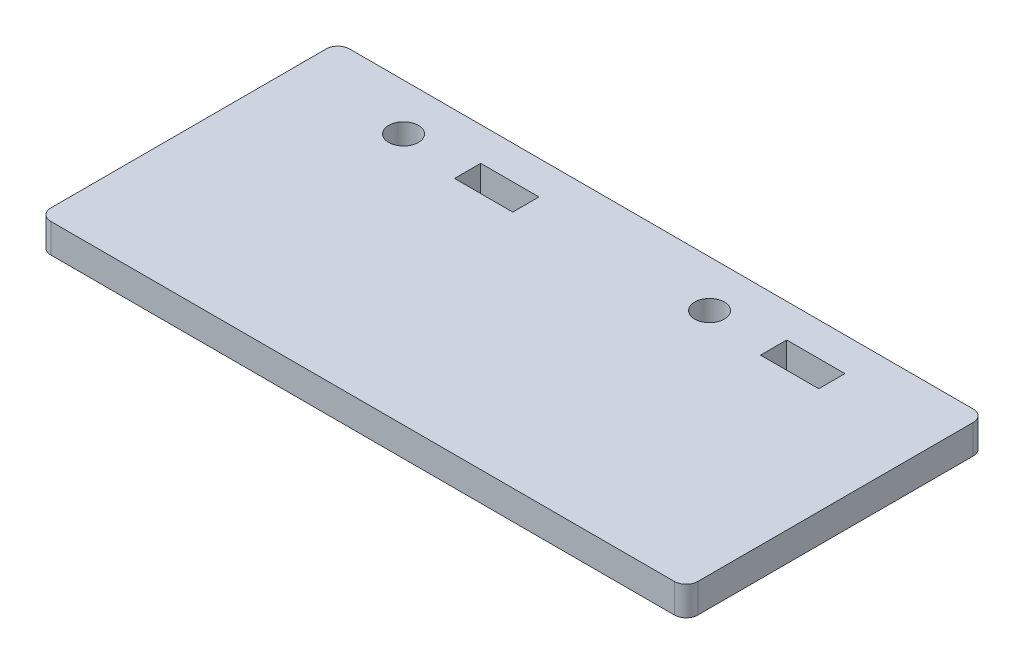
ISO-10303-21;
HEADER;
FILE_DESCRIPTION(('STEP AP214'),'2;1');
FILE_NAME('part.step','',(''),(''),'','','');
FILE_SCHEMA(('AUTOMOTIVE_DESIGN { 1 0 10303 214 1 1 1 1 }'));
ENDSEC;
DATA;
#1=APPLICATION_CONTEXT('core data for automotive mechanical design processes');
#2=APPLICATION_PROTOCOL_DEFINITION('international standard','automotive_design',2000,#1);
#3=PRODUCT_CONTEXT('',#1,'mechanical');
#4=PRODUCT('Part','Part','',(#3));
#5=PRODUCT_RELATED_PRODUCT_CATEGORY('part','',(#4));
#6=PRODUCT_DEFINITION_FORMATION('','',#4);
#7=PRODUCT_DEFINITION_CONTEXT('part definition',#1,'design');
#8=PRODUCT_DEFINITION('design','',#6,#7);
#9=PRODUCT_DEFINITION_SHAPE('','',#8);
#10=(LENGTH_UNIT() NAMED_UNIT(*) SI_UNIT(.MILLI.,.METRE.));
#11=(NAMED_UNIT(*) PLANE_ANGLE_UNIT() SI_UNIT($,.RADIAN.));
#12=(NAMED_UNIT(*) SI_UNIT($,.STERADIAN.) SOLID_ANGLE_UNIT());
#13=UNCERTAINTY_MEASURE_WITH_UNIT(LENGTH_MEASURE(1.E-05),#10,'distance_accuracy_value','');
#14=(GEOMETRIC_REPRESENTATION_CONTEXT(3) GLOBAL_UNCERTAINTY_ASSIGNED_CONTEXT((#13)) GLOBAL_UNIT_ASSIGNED_CONTEXT((#10,
#11,#12)) REPRESENTATION_CONTEXT('',''));
#15=CARTESIAN_POINT('',(0.,0.,0.));
#16=DIRECTION('',(0.,0.,1.));
#17=DIRECTION('',(1.,0.,0.));
#18=AXIS2_PLACEMENT_3D('',#15,#16,#17);
#19=CARTESIAN_POINT('',(0.,0.,0.));
#20=DIRECTION('',(0.,1.,0.));
#21=DIRECTION('',(0.,0.,1.));
#22=AXIS2_PLACEMENT_3D('',#19,#20,#21);
#23=PLANE('',#22);
#24=CARTESIAN_POINT('',(-30.025,0.,-17.65));
#25=DIRECTION('',(0.,-1.,0.));
#26=DIRECTION('',(0.,0.,-1.));
#27=AXIS2_PLACEMENT_3D('',#24,#25,#26);
#28=CIRCLE('',#27,1.8);
#29=CARTESIAN_POINT('',(-30.025,0.,-19.45));
#30=VERTEX_POINT('',#29);
#31=EDGE_CURVE('E793',#30,#30,#28,.T.);
#32=ORIENTED_EDGE('',*,*,#31,.F.);
#33=EDGE_LOOP('',(#32));
#34=FACE_BOUND('',#33,.T.);
#35=CARTESIAN_POINT('',(-10.525,0.,-17.65));
#36=DIRECTION('',(0.,-1.,0.));
#37=DIRECTION('',(0.,0.,-1.));
#38=AXIS2_PLACEMENT_3D('',#35,#36,#37);
#39=CIRCLE('',#38,1.8);
#40=CARTESIAN_POINT('',(-10.525,0.,-19.45));
#41=VERTEX_POINT('',#40);
#42=EDGE_CURVE('E801',#41,#41,#39,.T.);
#43=ORIENTED_EDGE('',*,*,#42,.F.);
#44=EDGE_LOOP('',(#43));
#45=FACE_BOUND('',#44,.T.);
#46=CARTESIAN_POINT('',(22.525,0.,-17.65));
#47=DIRECTION('',(0.,-1.,0.));
#48=DIRECTION('',(0.,0.,-1.));
#49=AXIS2_PLACEMENT_3D('',#46,#47,#48);
#50=CIRCLE('',#49,1.8);
#51=CARTESIAN_POINT('',(22.525,0.,-19.45));
#52=VERTEX_POINT('',#51);
#53=EDGE_CURVE('E807',#52,#52,#50,.T.);
#54=ORIENTED_EDGE('',*,*,#53,.F.);
#55=EDGE_LOOP('',(#54));
#56=FACE_BOUND('',#55,.T.);
#57=CARTESIAN_POINT('',(42.025,0.,-17.65));
#58=DIRECTION('',(0.,-1.,0.));
#59=DIRECTION('',(0.,0.,-1.));
#60=AXIS2_PLACEMENT_3D('',#57,#58,#59);
#61=CIRCLE('',#60,1.8);
#62=CARTESIAN_POINT('',(42.025,0.,-19.45));
#63=VERTEX_POINT('',#62);
#64=EDGE_CURVE('E813',#63,#63,#61,.T.);
#65=ORIENTED_EDGE('',*,*,#64,.F.);
#66=EDGE_LOOP('',(#65));
#67=FACE_BOUND('',#66,.T.);
#68=DIRECTION('',(-1.,0.,0.));
#69=VECTOR('',#68,1.);
#70=CARTESIAN_POINT('',(0.,0.,-19.9));
#71=LINE('',#70,#69);
#72=CARTESIAN_POINT('',(37.275,0.,-19.9));
#73=VERTEX_POINT('',#72);
#74=CARTESIAN_POINT('',(27.275,0.,-19.9));
#75=VERTEX_POINT('',#74);
#76=EDGE_CURVE('E278',#73,#75,#71,.T.);
#77=ORIENTED_EDGE('',*,*,#76,.T.);
#78=DIRECTION('',(0.,0.,1.));
#79=VECTOR('',#78,1.);
#80=CARTESIAN_POINT('',(27.275,0.,0.));
#81=LINE('',#80,#79);
#82=CARTESIAN_POINT('',(27.275,0.,-15.4));
#83=VERTEX_POINT('',#82);
#84=EDGE_CURVE('E281',#75,#83,#81,.T.);
#85=ORIENTED_EDGE('',*,*,#84,.T.);
#86=DIRECTION('',(1.,0.,0.));
#87=VECTOR('',#86,1.);
#88=CARTESIAN_POINT('',(0.,0.,-15.4));
#89=LINE('',#88,#87);
#90=CARTESIAN_POINT('',(37.275,0.,-15.4));
#91=VERTEX_POINT('',#90);
#92=EDGE_CURVE('E272',#83,#91,#89,.T.);
#93=ORIENTED_EDGE('',*,*,#92,.T.);
#94=DIRECTION('',(0.,0.,-1.));
#95=VECTOR('',#94,1.);
#96=CARTESIAN_POINT('',(37.275,0.,0.));
#97=LINE('',#96,#95);
#98=EDGE_CURVE('E275',#91,#73,#97,.T.);
#99=ORIENTED_EDGE('',*,*,#98,.T.);
#100=EDGE_LOOP('',(#77,#85,#93,#99));
#101=FACE_BOUND('',#100,.T.);
#102=DIRECTION('',(-1.,0.,0.));
#103=VECTOR('',#102,1.);
#104=CARTESIAN_POINT('',(0.,0.,-19.9));
#105=LINE('',#104,#103);
#106=CARTESIAN_POINT('',(-15.275,0.,-19.9));
#107=VERTEX_POINT('',#106);
#108=CARTESIAN_POINT('',(-25.275,0.,-19.9));
#109=VERTEX_POINT('',#108);
#110=EDGE_CURVE('E266',#107,#109,#105,.T.);
#111=ORIENTED_EDGE('',*,*,#110,.T.);
#112=DIRECTION('',(0.,0.,1.));
#113=VECTOR('',#112,1.);
#114=CARTESIAN_POINT('',(-25.275,0.,0.));
#115=LINE('',#114,#113);
#116=CARTESIAN_POINT('',(-25.275,0.,-15.4));
#117=VERTEX_POINT('',#116);
#118=EDGE_CURVE('E269',#109,#117,#115,.T.);
#119=ORIENTED_EDGE('',*,*,#118,.T.);
#120=DIRECTION('',(1.,0.,0.));
#121=VECTOR('',#120,1.);
#122=CARTESIAN_POINT('',(0.,0.,-15.4));
#123=LINE('',#122,#121);
#124=CARTESIAN_POINT('',(-15.275,0.,-15.4));
#125=VERTEX_POINT('',#124);
#126=EDGE_CURVE('E263',#117,#125,#123,.T.);
#127=ORIENTED_EDGE('',*,*,#126,.T.);
#128=DIRECTION('',(0.,0.,-1.));
#129=VECTOR('',#128,1.);
#130=CARTESIAN_POINT('',(-15.275,0.,0.));
#131=LINE('',#130,#129);
#132=EDGE_CURVE('E205',#125,#107,#131,.T.);
#133=ORIENTED_EDGE('',*,*,#132,.T.);
#134=EDGE_LOOP('',(#111,#119,#127,#133));
#135=FACE_BOUND('',#134,.T.);
#136=CARTESIAN_POINT('',(-36.275,0.,-17.65));
#137=DIRECTION('',(0.,1.,0.));
#138=DIRECTION('',(0.,0.,1.));
#139=AXIS2_PLACEMENT_3D('',#136,#137,#138);
#140=CIRCLE('',#139,2.55);
#141=CARTESIAN_POINT('',(-36.275,0.,-15.1));
#142=VERTEX_POINT('',#141);
#143=EDGE_CURVE('E260',#142,#142,#140,.T.);
#144=ORIENTED_EDGE('',*,*,#143,.T.);
#145=EDGE_LOOP('',(#144));
#146=FACE_BOUND('',#145,.T.);
#147=CARTESIAN_POINT('',(16.275,0.,-17.65));
#148=DIRECTION('',(0.,1.,0.));
#149=DIRECTION('',(0.,0.,1.));
#150=AXIS2_PLACEMENT_3D('',#147,#148,#149);
#151=CIRCLE('',#150,2.55);
#152=CARTESIAN_POINT('',(16.275,0.,-15.1));
#153=VERTEX_POINT('',#152);
#154=EDGE_CURVE('E257',#153,#153,#151,.T.);
#155=ORIENTED_EDGE('',*,*,#154,.T.);
#156=EDGE_LOOP('',(#155));
#157=FACE_BOUND('',#156,.T.);
#158=DIRECTION('',(0.,0.,1.));
#159=VECTOR('',#158,1.);
#160=CARTESIAN_POINT('',(-45.55,0.,-18.65));
#161=LINE('',#160,#159);
#162=CARTESIAN_POINT('',(-45.55,0.,-22.65));
#163=VERTEX_POINT('',#162);
#164=CARTESIAN_POINT('',(-45.55,0.,-18.65));
#165=VERTEX_POINT('',#164);
#166=EDGE_CURVE('E317',#163,#165,#161,.T.);
#167=ORIENTED_EDGE('',*,*,#166,.F.);
#168=DIRECTION('',(1.,0.,0.));
#169=VECTOR('',#168,1.);
#170=CARTESIAN_POINT('',(-50.55,0.,-22.65));
#171=LINE('',#170,#169);
#172=CARTESIAN_POINT('',(-50.55,0.,-22.65));
#173=VERTEX_POINT('',#172);
#174=EDGE_CURVE('E322',#173,#163,#171,.T.);
#175=ORIENTED_EDGE('',*,*,#174,.F.);
#176=DIRECTION('',(0.,0.,-1.));
#177=VECTOR('',#176,1.);
#178=CARTESIAN_POINT('',(-50.55,0.,-18.65));
#179=LINE('',#178,#177);
#180=CARTESIAN_POINT('',(-50.55,0.,-18.65));
#181=VERTEX_POINT('',#180);
#182=EDGE_CURVE('E334',#181,#173,#179,.T.);
#183=ORIENTED_EDGE('',*,*,#182,.F.);
#184=DIRECTION('',(-1.,0.,0.));
#185=VECTOR('',#184,1.);
#186=CARTESIAN_POINT('',(-50.55,0.,-18.65));
#187=LINE('',#186,#185);
#188=EDGE_CURVE('E331',#165,#181,#187,.T.);
#189=ORIENTED_EDGE('',*,*,#188,.F.);
#190=EDGE_LOOP('',(#167,#175,#183,#189));
#191=FACE_BOUND('',#190,.T.);
#192=DIRECTION('',(0.,0.,1.));
#193=VECTOR('',#192,1.);
#194=CARTESIAN_POINT('',(-55.55,0.,25.65));
#195=LINE('',#194,#193);
#196=CARTESIAN_POINT('',(-55.55,0.,-23.65));
#197=VERTEX_POINT('',#196);
#198=CARTESIAN_POINT('',(-55.55,0.,23.65));
#199=VERTEX_POINT('',#198);
#200=EDGE_CURVE('E350',#197,#199,#195,.T.);
#201=ORIENTED_EDGE('',*,*,#200,.F.);
#202=CARTESIAN_POINT('',(-53.55,0.,-23.65));
#203=DIRECTION('',(0.,1.,0.));
#204=DIRECTION('',(0.,0.,1.));
#205=AXIS2_PLACEMENT_3D('',#202,#203,#204);
#206=CIRCLE('',#205,2.);
#207=CARTESIAN_POINT('',(-53.55,0.,-25.65));
#208=VERTEX_POINT('',#207);
#209=EDGE_CURVE('E382',#197,#208,#206,.F.);
#210=ORIENTED_EDGE('',*,*,#209,.T.);
#211=DIRECTION('',(-1.,0.,0.));
#212=VECTOR('',#211,1.);
#213=CARTESIAN_POINT('',(55.55,0.,-25.65));
#214=LINE('',#213,#212);
#215=CARTESIAN_POINT('',(53.55,0.,-25.65));
#216=VERTEX_POINT('',#215);
#217=EDGE_CURVE('E355',#216,#208,#214,.T.);
#218=ORIENTED_EDGE('',*,*,#217,.F.);
#219=CARTESIAN_POINT('',(53.55,0.,-23.65));
#220=DIRECTION('',(0.,1.,0.));
#221=DIRECTION('',(0.,0.,1.));
#222=AXIS2_PLACEMENT_3D('',#219,#220,#221);
#223=CIRCLE('',#222,2.);
#224=CARTESIAN_POINT('',(55.55,0.,-23.65));
#225=VERTEX_POINT('',#224);
#226=EDGE_CURVE('E376',#216,#225,#223,.F.);
#227=ORIENTED_EDGE('',*,*,#226,.T.);
#228=DIRECTION('',(0.,0.,-1.));
#229=VECTOR('',#228,1.);
#230=CARTESIAN_POINT('',(55.55,0.,25.65));
#231=LINE('',#230,#229);
#232=CARTESIAN_POINT('',(55.55,0.,23.65));
#233=VERTEX_POINT('',#232);
#234=EDGE_CURVE('E368',#233,#225,#231,.T.);
#235=ORIENTED_EDGE('',*,*,#234,.F.);
#236=CARTESIAN_POINT('',(53.55,0.,23.65));
#237=DIRECTION('',(0.,1.,0.));
#238=DIRECTION('',(0.,0.,1.));
#239=AXIS2_PLACEMENT_3D('',#236,#237,#238);
#240=CIRCLE('',#239,2.);
#241=CARTESIAN_POINT('',(53.55,0.,25.65));
#242=VERTEX_POINT('',#241);
#243=EDGE_CURVE('E378',#233,#242,#240,.F.);
#244=ORIENTED_EDGE('',*,*,#243,.T.);
#245=DIRECTION('',(1.,0.,0.));
#246=VECTOR('',#245,1.);
#247=CARTESIAN_POINT('',(55.55,0.,25.65));
#248=LINE('',#247,#246);
#249=CARTESIAN_POINT('',(-53.55,0.,25.65));
#250=VERTEX_POINT('',#249);
#251=EDGE_CURVE('E365',#250,#242,#248,.T.);
#252=ORIENTED_EDGE('',*,*,#251,.F.);
#253=CARTESIAN_POINT('',(-53.55,0.,23.65));
#254=DIRECTION('',(0.,1.,0.));
#255=DIRECTION('',(0.,0.,1.));
#256=AXIS2_PLACEMENT_3D('',#253,#254,#255);
#257=CIRCLE('',#256,2.);
#258=EDGE_CURVE('E380',#250,#199,#257,.F.);
#259=ORIENTED_EDGE('',*,*,#258,.T.);
#260=EDGE_LOOP('',(#201,#210,#218,#227,#235,#244,#252,#259));
#261=FACE_BOUND('',#260,.T.);
#262=DIRECTION('',(-1.,0.,0.));
#263=VECTOR('',#262,1.);
#264=CARTESIAN_POINT('',(50.55,0.,-18.65));
#265=LINE('',#264,#263);
#266=CARTESIAN_POINT('',(50.55,0.,-18.65));
#267=VERTEX_POINT('',#266);
#268=CARTESIAN_POINT('',(45.55,0.,-18.65));
#269=VERTEX_POINT('',#268);
#270=EDGE_CURVE('E284',#267,#269,#265,.T.);
#271=ORIENTED_EDGE('',*,*,#270,.F.);
#272=DIRECTION('',(0.,0.,1.));
#273=VECTOR('',#272,1.);
#274=CARTESIAN_POINT('',(50.55,0.,-18.65));
#275=LINE('',#274,#273);
#276=CARTESIAN_POINT('',(50.55,0.,-22.65));
#277=VERTEX_POINT('',#276);
#278=EDGE_CURVE('E289',#277,#267,#275,.T.);
#279=ORIENTED_EDGE('',*,*,#278,.F.);
#280=DIRECTION('',(1.,0.,0.));
#281=VECTOR('',#280,1.);
#282=CARTESIAN_POINT('',(50.55,0.,-22.65));
#283=LINE('',#282,#281);
#284=CARTESIAN_POINT('',(45.55,0.,-22.65));
#285=VERTEX_POINT('',#284);
#286=EDGE_CURVE('E301',#285,#277,#283,.T.);
#287=ORIENTED_EDGE('',*,*,#286,.F.);
#288=DIRECTION('',(0.,0.,-1.));
#289=VECTOR('',#288,1.);
#290=CARTESIAN_POINT('',(45.55,0.,-18.65));
#291=LINE('',#290,#289);
#292=EDGE_CURVE('E298',#269,#285,#291,.T.);
#293=ORIENTED_EDGE('',*,*,#292,.F.);
#294=EDGE_LOOP('',(#271,#279,#287,#293));
#295=FACE_BOUND('',#294,.T.);
#296=ADVANCED_FACE('F35',(#34,#45,#56,#67,#101,#135,#146,#157,#191,#261,#295),#23,.F.);
#297=CARTESIAN_POINT('',(-55.55,5.,25.65));
#298=DIRECTION('',(1.,0.,0.));
#299=DIRECTION('',(0.,0.,-1.));
#300=AXIS2_PLACEMENT_3D('',#297,#298,#299);
#301=PLANE('',#300);
#302=DIRECTION('',(0.,0.,1.));
#303=VECTOR('',#302,1.);
#304=CARTESIAN_POINT('',(-55.55,5.,25.65));
#305=LINE('',#304,#303);
#306=CARTESIAN_POINT('',(-55.55,5.,-23.65));
#307=VERTEX_POINT('',#306);
#308=CARTESIAN_POINT('',(-55.55,5.,23.65));
#309=VERTEX_POINT('',#308);
#310=EDGE_CURVE('E351',#307,#309,#305,.T.);
#311=ORIENTED_EDGE('',*,*,#310,.F.);
#312=DIRECTION('',(0.,-1.,0.));
#313=VECTOR('',#312,1.);
#314=CARTESIAN_POINT('',(-55.55,5.,-23.65));
#315=LINE('',#314,#313);
#316=EDGE_CURVE('E373',#307,#197,#315,.T.);
#317=ORIENTED_EDGE('',*,*,#316,.T.);
#318=ORIENTED_EDGE('',*,*,#200,.T.);
#319=DIRECTION('',(0.,-1.,0.));
#320=VECTOR('',#319,1.);
#321=CARTESIAN_POINT('',(-55.55,5.,23.65));
#322=LINE('',#321,#320);
#323=EDGE_CURVE('E362',#199,#309,#322,.F.);
#324=ORIENTED_EDGE('',*,*,#323,.T.);
#325=EDGE_LOOP('',(#311,#317,#318,#324));
#326=FACE_BOUND('',#325,.T.);
#327=ADVANCED_FACE('F430',(#326),#301,.F.);
#328=CARTESIAN_POINT('',(55.55,5.,25.65));
#329=DIRECTION('',(0.,0.,-1.));
#330=DIRECTION('',(-1.,0.,0.));
#331=AXIS2_PLACEMENT_3D('',#328,#329,#330);
#332=PLANE('',#331);
#333=DIRECTION('',(1.,0.,0.));
#334=VECTOR('',#333,1.);
#335=CARTESIAN_POINT('',(55.55,5.,25.65));
#336=LINE('',#335,#334);
#337=CARTESIAN_POINT('',(-53.55,5.,25.65));
#338=VERTEX_POINT('',#337);
#339=CARTESIAN_POINT('',(53.55,5.,25.65));
#340=VERTEX_POINT('',#339);
#341=EDGE_CURVE('E354',#338,#340,#336,.T.);
#342=ORIENTED_EDGE('',*,*,#341,.F.);
#343=DIRECTION('',(0.,-1.,0.));
#344=VECTOR('',#343,1.);
#345=CARTESIAN_POINT('',(-53.55,5.,25.65));
#346=LINE('',#345,#344);
#347=EDGE_CURVE('E398',#338,#250,#346,.T.);
#348=ORIENTED_EDGE('',*,*,#347,.T.);
#349=ORIENTED_EDGE('',*,*,#251,.T.);
#350=DIRECTION('',(0.,-1.,0.));
#351=VECTOR('',#350,1.);
#352=CARTESIAN_POINT('',(53.55,5.,25.65));
#353=LINE('',#352,#351);
#354=EDGE_CURVE('E396',#242,#340,#353,.F.);
#355=ORIENTED_EDGE('',*,*,#354,.T.);
#356=EDGE_LOOP('',(#342,#348,#349,#355));
#357=FACE_BOUND('',#356,.T.);
#358=ADVANCED_FACE('F404',(#357),#332,.F.);
#359=CARTESIAN_POINT('',(55.55,5.,25.65));
#360=DIRECTION('',(-1.,0.,0.));
#361=DIRECTION('',(0.,0.,1.));
#362=AXIS2_PLACEMENT_3D('',#359,#360,#361);
#363=PLANE('',#362);
#364=DIRECTION('',(0.,0.,-1.));
#365=VECTOR('',#364,1.);
#366=CARTESIAN_POINT('',(55.55,5.,25.65));
#367=LINE('',#366,#365);
#368=CARTESIAN_POINT('',(55.55,5.,23.65));
#369=VERTEX_POINT('',#368);
#370=CARTESIAN_POINT('',(55.55,5.,-23.65));
#371=VERTEX_POINT('',#370);
#372=EDGE_CURVE('E357',#369,#371,#367,.T.);
#373=ORIENTED_EDGE('',*,*,#372,.F.);
#374=DIRECTION('',(0.,-1.,0.));
#375=VECTOR('',#374,1.);
#376=CARTESIAN_POINT('',(55.55,5.,23.65));
#377=LINE('',#376,#375);
#378=EDGE_CURVE('E11',#369,#233,#377,.T.);
#379=ORIENTED_EDGE('',*,*,#378,.T.);
#380=ORIENTED_EDGE('',*,*,#234,.T.);
#381=DIRECTION('',(0.,-1.,0.));
#382=VECTOR('',#381,1.);
#383=CARTESIAN_POINT('',(55.55,5.,-23.65));
#384=LINE('',#383,#382);
#385=EDGE_CURVE('E43',#225,#371,#384,.F.);
#386=ORIENTED_EDGE('',*,*,#385,.T.);
#387=EDGE_LOOP('',(#373,#379,#380,#386));
#388=FACE_BOUND('',#387,.T.);
#389=ADVANCED_FACE('F415',(#388),#363,.F.);
#390=CARTESIAN_POINT('',(55.55,5.,-25.65));
#391=DIRECTION('',(0.,0.,1.));
#392=DIRECTION('',(1.,0.,0.));
#393=AXIS2_PLACEMENT_3D('',#390,#391,#392);
#394=PLANE('',#393);
#395=ORIENTED_EDGE('',*,*,#217,.T.);
#396=DIRECTION('',(0.,-1.,0.));
#397=VECTOR('',#396,1.);
#398=CARTESIAN_POINT('',(-53.55,5.,-25.65));
#399=LINE('',#398,#397);
#400=CARTESIAN_POINT('',(-53.55,5.,-25.65));
#401=VERTEX_POINT('',#400);
#402=EDGE_CURVE('E387',#208,#401,#399,.F.);
#403=ORIENTED_EDGE('',*,*,#402,.T.);
#404=DIRECTION('',(-1.,0.,0.));
#405=VECTOR('',#404,1.);
#406=CARTESIAN_POINT('',(55.55,5.,-25.65));
#407=LINE('',#406,#405);
#408=CARTESIAN_POINT('',(53.55,5.,-25.65));
#409=VERTEX_POINT('',#408);
#410=EDGE_CURVE('E359',#409,#401,#407,.T.);
#411=ORIENTED_EDGE('',*,*,#410,.F.);
#412=DIRECTION('',(0.,-1.,0.));
#413=VECTOR('',#412,1.);
#414=CARTESIAN_POINT('',(53.55,5.,-25.65));
#415=LINE('',#414,#413);
#416=EDGE_CURVE('E384',#409,#216,#415,.T.);
#417=ORIENTED_EDGE('',*,*,#416,.T.);
#418=EDGE_LOOP('',(#395,#403,#411,#417));
#419=FACE_BOUND('',#418,.T.);
#420=ADVANCED_FACE('F422',(#419),#394,.F.);
#421=CARTESIAN_POINT('',(0.,5.,0.));
#422=DIRECTION('',(0.,1.,0.));
#423=DIRECTION('',(0.,0.,1.));
#424=AXIS2_PLACEMENT_3D('',#421,#422,#423);
#425=PLANE('',#424);
#426=DIRECTION('',(0.,0.,1.));
#427=VECTOR('',#426,1.);
#428=CARTESIAN_POINT('',(27.275,5.,-15.4));
#429=LINE('',#428,#427);
#430=CARTESIAN_POINT('',(27.275,5.,-19.9));
#431=VERTEX_POINT('',#430);
#432=CARTESIAN_POINT('',(27.275,5.,-15.4));
#433=VERTEX_POINT('',#432);
#434=EDGE_CURVE('E233',#431,#433,#429,.T.);
#435=ORIENTED_EDGE('',*,*,#434,.F.);
#436=DIRECTION('',(-1.,0.,0.));
#437=VECTOR('',#436,1.);
#438=CARTESIAN_POINT('',(37.275,5.,-19.9));
#439=LINE('',#438,#437);
#440=CARTESIAN_POINT('',(37.275,5.,-19.9));
#441=VERTEX_POINT('',#440);
#442=EDGE_CURVE('E242',#441,#431,#439,.T.);
#443=ORIENTED_EDGE('',*,*,#442,.F.);
#444=DIRECTION('',(0.,0.,-1.));
#445=VECTOR('',#444,1.);
#446=CARTESIAN_POINT('',(37.275,5.,-15.4));
#447=LINE('',#446,#445);
#448=CARTESIAN_POINT('',(37.275,5.,-15.4));
#449=VERTEX_POINT('',#448);
#450=EDGE_CURVE('E239',#449,#441,#447,.T.);
#451=ORIENTED_EDGE('',*,*,#450,.F.);
#452=DIRECTION('',(1.,0.,0.));
#453=VECTOR('',#452,1.);
#454=CARTESIAN_POINT('',(37.275,5.,-15.4));
#455=LINE('',#454,#453);
#456=EDGE_CURVE('E235',#433,#449,#455,.T.);
#457=ORIENTED_EDGE('',*,*,#456,.F.);
#458=EDGE_LOOP('',(#435,#443,#451,#457));
#459=FACE_BOUND('',#458,.T.);
#460=DIRECTION('',(0.,0.,1.));
#461=VECTOR('',#460,1.);
#462=CARTESIAN_POINT('',(-25.275,5.,-15.4));
#463=LINE('',#462,#461);
#464=CARTESIAN_POINT('',(-25.275,5.,-19.9));
#465=VERTEX_POINT('',#464);
#466=CARTESIAN_POINT('',(-25.275,5.,-15.4));
#467=VERTEX_POINT('',#466);
#468=EDGE_CURVE('E218',#465,#467,#463,.T.);
#469=ORIENTED_EDGE('',*,*,#468,.F.);
#470=DIRECTION('',(-1.,0.,0.));
#471=VECTOR('',#470,1.);
#472=CARTESIAN_POINT('',(-15.275,5.,-19.9));
#473=LINE('',#472,#471);
#474=CARTESIAN_POINT('',(-15.275,5.,-19.9));
#475=VERTEX_POINT('',#474);
#476=EDGE_CURVE('E223',#475,#465,#473,.T.);
#477=ORIENTED_EDGE('',*,*,#476,.F.);
#478=DIRECTION('',(0.,0.,-1.));
#479=VECTOR('',#478,1.);
#480=CARTESIAN_POINT('',(-15.275,5.,-15.4));
#481=LINE('',#480,#479);
#482=CARTESIAN_POINT('',(-15.275,5.,-15.4));
#483=VERTEX_POINT('',#482);
#484=EDGE_CURVE('E202',#483,#475,#481,.T.);
#485=ORIENTED_EDGE('',*,*,#484,.F.);
#486=DIRECTION('',(1.,0.,0.));
#487=VECTOR('',#486,1.);
#488=CARTESIAN_POINT('',(-15.275,5.,-15.4));
#489=LINE('',#488,#487);
#490=EDGE_CURVE('E213',#467,#483,#489,.T.);
#491=ORIENTED_EDGE('',*,*,#490,.F.);
#492=EDGE_LOOP('',(#469,#477,#485,#491));
#493=FACE_BOUND('',#492,.T.);
#494=CARTESIAN_POINT('',(-36.275,5.,-17.65));
#495=DIRECTION('',(0.,1.,0.));
#496=DIRECTION('',(0.,0.,1.));
#497=AXIS2_PLACEMENT_3D('',#494,#495,#496);
#498=CIRCLE('',#497,2.55);
#499=CARTESIAN_POINT('',(-36.275,5.,-15.1));
#500=VERTEX_POINT('',#499);
#501=EDGE_CURVE('E230',#500,#500,#498,.T.);
#502=ORIENTED_EDGE('',*,*,#501,.F.);
#503=EDGE_LOOP('',(#502));
#504=FACE_BOUND('',#503,.T.);
#505=CARTESIAN_POINT('',(16.275,5.,-17.65));
#506=DIRECTION('',(0.,1.,0.));
#507=DIRECTION('',(0.,0.,1.));
#508=AXIS2_PLACEMENT_3D('',#505,#506,#507);
#509=CIRCLE('',#508,2.55);
#510=CARTESIAN_POINT('',(16.275,5.,-15.1));
#511=VERTEX_POINT('',#510);
#512=EDGE_CURVE('E254',#511,#511,#509,.T.);
#513=ORIENTED_EDGE('',*,*,#512,.F.);
#514=EDGE_LOOP('',(#513));
#515=FACE_BOUND('',#514,.T.);
#516=ORIENTED_EDGE('',*,*,#410,.T.);
#517=CARTESIAN_POINT('',(-53.55,5.,-23.65));
#518=DIRECTION('',(0.,1.,0.));
#519=DIRECTION('',(0.,0.,1.));
#520=AXIS2_PLACEMENT_3D('',#517,#518,#519);
#521=CIRCLE('',#520,2.);
#522=EDGE_CURVE('E394',#401,#307,#521,.T.);
#523=ORIENTED_EDGE('',*,*,#522,.T.);
#524=ORIENTED_EDGE('',*,*,#310,.T.);
#525=CARTESIAN_POINT('',(-53.55,5.,23.65));
#526=DIRECTION('',(0.,1.,0.));
#527=DIRECTION('',(0.,0.,1.));
#528=AXIS2_PLACEMENT_3D('',#525,#526,#527);
#529=CIRCLE('',#528,2.);
#530=EDGE_CURVE('E392',#309,#338,#529,.T.);
#531=ORIENTED_EDGE('',*,*,#530,.T.);
#532=ORIENTED_EDGE('',*,*,#341,.T.);
#533=CARTESIAN_POINT('',(53.55,5.,23.65));
#534=DIRECTION('',(0.,1.,0.));
#535=DIRECTION('',(0.,0.,1.));
#536=AXIS2_PLACEMENT_3D('',#533,#534,#535);
#537=CIRCLE('',#536,2.);
#538=EDGE_CURVE('E56',#340,#369,#537,.T.);
#539=ORIENTED_EDGE('',*,*,#538,.T.);
#540=ORIENTED_EDGE('',*,*,#372,.T.);
#541=CARTESIAN_POINT('',(53.55,5.,-23.65));
#542=DIRECTION('',(0.,1.,0.));
#543=DIRECTION('',(0.,0.,1.));
#544=AXIS2_PLACEMENT_3D('',#541,#542,#543);
#545=CIRCLE('',#544,2.);
#546=EDGE_CURVE('E389',#371,#409,#545,.T.);
#547=ORIENTED_EDGE('',*,*,#546,.T.);
#548=EDGE_LOOP('',(#516,#523,#524,#531,#532,#539,#540,#547));
#549=FACE_BOUND('',#548,.T.);
#550=ADVANCED_FACE('F220',(#459,#493,#504,#515,#549),#425,.T.);
#551=CARTESIAN_POINT('',(-45.55,-3.,-18.65));
#552=DIRECTION('',(-1.,0.,0.));
#553=DIRECTION('',(0.,0.,1.));
#554=AXIS2_PLACEMENT_3D('',#551,#552,#553);
#555=PLANE('',#554);
#556=ORIENTED_EDGE('',*,*,#166,.T.);
#557=DIRECTION('',(0.,1.,0.));
#558=VECTOR('',#557,1.);
#559=CARTESIAN_POINT('',(-45.55,-3.,-18.65));
#560=LINE('',#559,#558);
#561=CARTESIAN_POINT('',(-45.55,-3.,-18.65));
#562=VERTEX_POINT('',#561);
#563=EDGE_CURVE('E347',#562,#165,#560,.T.);
#564=ORIENTED_EDGE('',*,*,#563,.F.);
#565=DIRECTION('',(0.,0.,1.));
#566=VECTOR('',#565,1.);
#567=CARTESIAN_POINT('',(-45.55,-3.,-18.65));
#568=LINE('',#567,#566);
#569=CARTESIAN_POINT('',(-45.55,-3.,-22.65));
#570=VERTEX_POINT('',#569);
#571=EDGE_CURVE('E318',#570,#562,#568,.T.);
#572=ORIENTED_EDGE('',*,*,#571,.F.);
#573=DIRECTION('',(0.,1.,0.));
#574=VECTOR('',#573,1.);
#575=CARTESIAN_POINT('',(-45.55,-3.,-22.65));
#576=LINE('',#575,#574);
#577=EDGE_CURVE('E328',#570,#163,#576,.T.);
#578=ORIENTED_EDGE('',*,*,#577,.T.);
#579=EDGE_LOOP('',(#556,#564,#572,#578));
#580=FACE_BOUND('',#579,.T.);
#581=ADVANCED_FACE('F476',(#580),#555,.F.);
#582=CARTESIAN_POINT('',(-50.55,-3.,-18.65));
#583=DIRECTION('',(0.,0.,-1.));
#584=DIRECTION('',(-1.,0.,0.));
#585=AXIS2_PLACEMENT_3D('',#582,#583,#584);
#586=PLANE('',#585);
#587=ORIENTED_EDGE('',*,*,#188,.T.);
#588=DIRECTION('',(0.,1.,0.));
#589=VECTOR('',#588,1.);
#590=CARTESIAN_POINT('',(-50.55,-3.,-18.65));
#591=LINE('',#590,#589);
#592=CARTESIAN_POINT('',(-50.55,-3.,-18.65));
#593=VERTEX_POINT('',#592);
#594=EDGE_CURVE('E344',#593,#181,#591,.T.);
#595=ORIENTED_EDGE('',*,*,#594,.F.);
#596=DIRECTION('',(-1.,0.,0.));
#597=VECTOR('',#596,1.);
#598=CARTESIAN_POINT('',(-50.55,-3.,-18.65));
#599=LINE('',#598,#597);
#600=EDGE_CURVE('E321',#562,#593,#599,.T.);
#601=ORIENTED_EDGE('',*,*,#600,.F.);
#602=ORIENTED_EDGE('',*,*,#563,.T.);
#603=EDGE_LOOP('',(#587,#595,#601,#602));
#604=FACE_BOUND('',#603,.T.);
#605=ADVANCED_FACE('F484',(#604),#586,.F.);
#606=CARTESIAN_POINT('',(-50.55,-3.,-18.65));
#607=DIRECTION('',(1.,0.,0.));
#608=DIRECTION('',(0.,0.,-1.));
#609=AXIS2_PLACEMENT_3D('',#606,#607,#608);
#610=PLANE('',#609);
#611=ORIENTED_EDGE('',*,*,#182,.T.);
#612=DIRECTION('',(0.,1.,0.));
#613=VECTOR('',#612,1.);
#614=CARTESIAN_POINT('',(-50.55,-3.,-22.65));
#615=LINE('',#614,#613);
#616=CARTESIAN_POINT('',(-50.55,-3.,-22.65));
#617=VERTEX_POINT('',#616);
#618=EDGE_CURVE('E341',#617,#173,#615,.T.);
#619=ORIENTED_EDGE('',*,*,#618,.F.);
#620=DIRECTION('',(0.,0.,-1.));
#621=VECTOR('',#620,1.);
#622=CARTESIAN_POINT('',(-50.55,-3.,-18.65));
#623=LINE('',#622,#621);
#624=EDGE_CURVE('E324',#593,#617,#623,.T.);
#625=ORIENTED_EDGE('',*,*,#624,.F.);
#626=ORIENTED_EDGE('',*,*,#594,.T.);
#627=EDGE_LOOP('',(#611,#619,#625,#626));
#628=FACE_BOUND('',#627,.T.);
#629=ADVANCED_FACE('F491',(#628),#610,.F.);
#630=CARTESIAN_POINT('',(-50.55,-3.,-22.65));
#631=DIRECTION('',(0.,0.,1.));
#632=DIRECTION('',(1.,0.,0.));
#633=AXIS2_PLACEMENT_3D('',#630,#631,#632);
#634=PLANE('',#633);
#635=ORIENTED_EDGE('',*,*,#174,.T.);
#636=ORIENTED_EDGE('',*,*,#577,.F.);
#637=DIRECTION('',(1.,0.,0.));
#638=VECTOR('',#637,1.);
#639=CARTESIAN_POINT('',(-50.55,-3.,-22.65));
#640=LINE('',#639,#638);
#641=EDGE_CURVE('E326',#617,#570,#640,.T.);
#642=ORIENTED_EDGE('',*,*,#641,.F.);
#643=ORIENTED_EDGE('',*,*,#618,.T.);
#644=EDGE_LOOP('',(#635,#636,#642,#643));
#645=FACE_BOUND('',#644,.T.);
#646=ADVANCED_FACE('F499',(#645),#634,.F.);
#647=CARTESIAN_POINT('',(0.,-3.,0.));
#648=DIRECTION('',(0.,-1.,0.));
#649=DIRECTION('',(0.,0.,-1.));
#650=AXIS2_PLACEMENT_3D('',#647,#648,#649);
#651=PLANE('',#650);
#652=ORIENTED_EDGE('',*,*,#571,.T.);
#653=ORIENTED_EDGE('',*,*,#600,.T.);
#654=ORIENTED_EDGE('',*,*,#624,.T.);
#655=ORIENTED_EDGE('',*,*,#641,.T.);
#656=EDGE_LOOP('',(#652,#653,#654,#655));
#657=FACE_BOUND('',#656,.T.);
#658=ADVANCED_FACE('F507',(#657),#651,.T.);
#659=CARTESIAN_POINT('',(50.55,-3.,-18.65));
#660=DIRECTION('',(0.,0.,-1.));
#661=DIRECTION('',(-1.,0.,0.));
#662=AXIS2_PLACEMENT_3D('',#659,#660,#661);
#663=PLANE('',#662);
#664=ORIENTED_EDGE('',*,*,#270,.T.);
#665=DIRECTION('',(0.,1.,0.));
#666=VECTOR('',#665,1.);
#667=CARTESIAN_POINT('',(45.55,-3.,-18.65));
#668=LINE('',#667,#666);
#669=CARTESIAN_POINT('',(45.55,-3.,-18.65));
#670=VERTEX_POINT('',#669);
#671=EDGE_CURVE('E314',#670,#269,#668,.T.);
#672=ORIENTED_EDGE('',*,*,#671,.F.);
#673=DIRECTION('',(-1.,0.,0.));
#674=VECTOR('',#673,1.);
#675=CARTESIAN_POINT('',(50.55,-3.,-18.65));
#676=LINE('',#675,#674);
#677=CARTESIAN_POINT('',(50.55,-3.,-18.65));
#678=VERTEX_POINT('',#677);
#679=EDGE_CURVE('E285',#678,#670,#676,.T.);
#680=ORIENTED_EDGE('',*,*,#679,.F.);
#681=DIRECTION('',(0.,1.,0.));
#682=VECTOR('',#681,1.);
#683=CARTESIAN_POINT('',(50.55,-3.,-18.65));
#684=LINE('',#683,#682);
#685=EDGE_CURVE('E295',#678,#267,#684,.T.);
#686=ORIENTED_EDGE('',*,*,#685,.T.);
#687=EDGE_LOOP('',(#664,#672,#680,#686));
#688=FACE_BOUND('',#687,.T.);
#689=ADVANCED_FACE('F515',(#688),#663,.F.);
#690=CARTESIAN_POINT('',(45.55,-3.,-18.65));
#691=DIRECTION('',(1.,0.,0.));
#692=DIRECTION('',(0.,0.,-1.));
#693=AXIS2_PLACEMENT_3D('',#690,#691,#692);
#694=PLANE('',#693);
#695=ORIENTED_EDGE('',*,*,#292,.T.);
#696=DIRECTION('',(0.,1.,0.));
#697=VECTOR('',#696,1.);
#698=CARTESIAN_POINT('',(45.55,-3.,-22.65));
#699=LINE('',#698,#697);
#700=CARTESIAN_POINT('',(45.55,-3.,-22.65));
#701=VERTEX_POINT('',#700);
#702=EDGE_CURVE('E311',#701,#285,#699,.T.);
#703=ORIENTED_EDGE('',*,*,#702,.F.);
#704=DIRECTION('',(0.,0.,-1.));
#705=VECTOR('',#704,1.);
#706=CARTESIAN_POINT('',(45.55,-3.,-18.65));
#707=LINE('',#706,#705);
#708=EDGE_CURVE('E288',#670,#701,#707,.T.);
#709=ORIENTED_EDGE('',*,*,#708,.F.);
#710=ORIENTED_EDGE('',*,*,#671,.T.);
#711=EDGE_LOOP('',(#695,#703,#709,#710));
#712=FACE_BOUND('',#711,.T.);
#713=ADVANCED_FACE('F523',(#712),#694,.F.);
#714=CARTESIAN_POINT('',(50.55,-3.,-22.65));
#715=DIRECTION('',(0.,0.,1.));
#716=DIRECTION('',(1.,0.,0.));
#717=AXIS2_PLACEMENT_3D('',#714,#715,#716);
#718=PLANE('',#717);
#719=ORIENTED_EDGE('',*,*,#286,.T.);
#720=DIRECTION('',(0.,1.,0.));
#721=VECTOR('',#720,1.);
#722=CARTESIAN_POINT('',(50.55,-3.,-22.65));
#723=LINE('',#722,#721);
#724=CARTESIAN_POINT('',(50.55,-3.,-22.65));
#725=VERTEX_POINT('',#724);
#726=EDGE_CURVE('E308',#725,#277,#723,.T.);
#727=ORIENTED_EDGE('',*,*,#726,.F.);
#728=DIRECTION('',(1.,0.,0.));
#729=VECTOR('',#728,1.);
#730=CARTESIAN_POINT('',(50.55,-3.,-22.65));
#731=LINE('',#730,#729);
#732=EDGE_CURVE('E291',#701,#725,#731,.T.);
#733=ORIENTED_EDGE('',*,*,#732,.F.);
#734=ORIENTED_EDGE('',*,*,#702,.T.);
#735=EDGE_LOOP('',(#719,#727,#733,#734));
#736=FACE_BOUND('',#735,.T.);
#737=ADVANCED_FACE('F531',(#736),#718,.F.);
#738=CARTESIAN_POINT('',(50.55,-3.,-18.65));
#739=DIRECTION('',(-1.,0.,0.));
#740=DIRECTION('',(0.,0.,1.));
#741=AXIS2_PLACEMENT_3D('',#738,#739,#740);
#742=PLANE('',#741);
#743=ORIENTED_EDGE('',*,*,#278,.T.);
#744=ORIENTED_EDGE('',*,*,#685,.F.);
#745=DIRECTION('',(0.,0.,1.));
#746=VECTOR('',#745,1.);
#747=CARTESIAN_POINT('',(50.55,-3.,-18.65));
#748=LINE('',#747,#746);
#749=EDGE_CURVE('E293',#725,#678,#748,.T.);
#750=ORIENTED_EDGE('',*,*,#749,.F.);
#751=ORIENTED_EDGE('',*,*,#726,.T.);
#752=EDGE_LOOP('',(#743,#744,#750,#751));
#753=FACE_BOUND('',#752,.T.);
#754=ADVANCED_FACE('F539',(#753),#742,.F.);
#755=CARTESIAN_POINT('',(0.,-3.,0.));
#756=DIRECTION('',(0.,-1.,0.));
#757=DIRECTION('',(0.,0.,-1.));
#758=AXIS2_PLACEMENT_3D('',#755,#756,#757);
#759=PLANE('',#758);
#760=ORIENTED_EDGE('',*,*,#679,.T.);
#761=ORIENTED_EDGE('',*,*,#708,.T.);
#762=ORIENTED_EDGE('',*,*,#732,.T.);
#763=ORIENTED_EDGE('',*,*,#749,.T.);
#764=EDGE_LOOP('',(#760,#761,#762,#763));
#765=FACE_BOUND('',#764,.T.);
#766=ADVANCED_FACE('F547',(#765),#759,.T.);
#767=CARTESIAN_POINT('',(16.275,-5.,-17.65));
#768=DIRECTION('',(0.,1.,0.));
#769=DIRECTION('',(0.,0.,1.));
#770=AXIS2_PLACEMENT_3D('',#767,#768,#769);
#771=CYLINDRICAL_SURFACE('',#770,2.55);
#772=ORIENTED_EDGE('',*,*,#512,.T.);
#773=EDGE_LOOP('',(#772));
#774=FACE_BOUND('',#773,.T.);
#775=ORIENTED_EDGE('',*,*,#154,.F.);
#776=EDGE_LOOP('',(#775));
#777=FACE_BOUND('',#776,.T.);
#778=ADVANCED_FACE('F555',(#774,#777),#771,.F.);
#779=CARTESIAN_POINT('',(-36.275,-5.,-17.65));
#780=DIRECTION('',(0.,1.,0.));
#781=DIRECTION('',(0.,0.,1.));
#782=AXIS2_PLACEMENT_3D('',#779,#780,#781);
#783=CYLINDRICAL_SURFACE('',#782,2.55);
#784=ORIENTED_EDGE('',*,*,#501,.T.);
#785=EDGE_LOOP('',(#784));
#786=FACE_BOUND('',#785,.T.);
#787=ORIENTED_EDGE('',*,*,#143,.F.);
#788=EDGE_LOOP('',(#787));
#789=FACE_BOUND('',#788,.T.);
#790=ADVANCED_FACE('F563',(#786,#789),#783,.F.);
#791=CARTESIAN_POINT('',(-25.275,-5.,-15.4));
#792=DIRECTION('',(-1.,0.,0.));
#793=DIRECTION('',(0.,0.,1.));
#794=AXIS2_PLACEMENT_3D('',#791,#792,#793);
#795=PLANE('',#794);
#796=DIRECTION('',(0.,1.,0.));
#797=VECTOR('',#796,1.);
#798=CARTESIAN_POINT('',(-25.275,-5.,-19.9));
#799=LINE('',#798,#797);
#800=EDGE_CURVE('E228',#109,#465,#799,.T.);
#801=ORIENTED_EDGE('',*,*,#800,.T.);
#802=ORIENTED_EDGE('',*,*,#468,.T.);
#803=DIRECTION('',(0.,1.,0.));
#804=VECTOR('',#803,1.);
#805=CARTESIAN_POINT('',(-25.275,-5.,-15.4));
#806=LINE('',#805,#804);
#807=EDGE_CURVE('E209',#117,#467,#806,.T.);
#808=ORIENTED_EDGE('',*,*,#807,.F.);
#809=ORIENTED_EDGE('',*,*,#118,.F.);
#810=EDGE_LOOP('',(#801,#802,#808,#809));
#811=FACE_BOUND('',#810,.T.);
#812=ADVANCED_FACE('F571',(#811),#795,.F.);
#813=CARTESIAN_POINT('',(-15.275,-5.,-19.9));
#814=DIRECTION('',(0.,0.,-1.));
#815=DIRECTION('',(-1.,0.,0.));
#816=AXIS2_PLACEMENT_3D('',#813,#814,#815);
#817=PLANE('',#816);
#818=DIRECTION('',(0.,1.,0.));
#819=VECTOR('',#818,1.);
#820=CARTESIAN_POINT('',(-15.275,-5.,-19.9));
#821=LINE('',#820,#819);
#822=EDGE_CURVE('E208',#107,#475,#821,.T.);
#823=ORIENTED_EDGE('',*,*,#822,.T.);
#824=ORIENTED_EDGE('',*,*,#476,.T.);
#825=ORIENTED_EDGE('',*,*,#800,.F.);
#826=ORIENTED_EDGE('',*,*,#110,.F.);
#827=EDGE_LOOP('',(#823,#824,#825,#826));
#828=FACE_BOUND('',#827,.T.);
#829=ADVANCED_FACE('F579',(#828),#817,.F.);
#830=CARTESIAN_POINT('',(-15.275,-5.,-15.4));
#831=DIRECTION('',(1.,0.,0.));
#832=DIRECTION('',(0.,0.,-1.));
#833=AXIS2_PLACEMENT_3D('',#830,#831,#832);
#834=PLANE('',#833);
#835=DIRECTION('',(0.,1.,0.));
#836=VECTOR('',#835,1.);
#837=CARTESIAN_POINT('',(-15.275,-5.,-15.4));
#838=LINE('',#837,#836);
#839=EDGE_CURVE('E197',#125,#483,#838,.T.);
#840=ORIENTED_EDGE('',*,*,#839,.T.);
#841=ORIENTED_EDGE('',*,*,#484,.T.);
#842=ORIENTED_EDGE('',*,*,#822,.F.);
#843=ORIENTED_EDGE('',*,*,#132,.F.);
#844=EDGE_LOOP('',(#840,#841,#842,#843));
#845=FACE_BOUND('',#844,.T.);
#846=ADVANCED_FACE('F199',(#845),#834,.F.);
#847=CARTESIAN_POINT('',(-15.275,-5.,-15.4));
#848=DIRECTION('',(0.,0.,1.));
#849=DIRECTION('',(1.,0.,0.));
#850=AXIS2_PLACEMENT_3D('',#847,#848,#849);
#851=PLANE('',#850);
#852=ORIENTED_EDGE('',*,*,#807,.T.);
#853=ORIENTED_EDGE('',*,*,#490,.T.);
#854=ORIENTED_EDGE('',*,*,#839,.F.);
#855=ORIENTED_EDGE('',*,*,#126,.F.);
#856=EDGE_LOOP('',(#852,#853,#854,#855));
#857=FACE_BOUND('',#856,.T.);
#858=ADVANCED_FACE('F214',(#857),#851,.F.);
#859=CARTESIAN_POINT('',(27.275,-5.,-15.4));
#860=DIRECTION('',(-1.,0.,0.));
#861=DIRECTION('',(0.,0.,1.));
#862=AXIS2_PLACEMENT_3D('',#859,#860,#861);
#863=PLANE('',#862);
#864=DIRECTION('',(0.,1.,0.));
#865=VECTOR('',#864,1.);
#866=CARTESIAN_POINT('',(27.275,-5.,-19.9));
#867=LINE('',#866,#865);
#868=EDGE_CURVE('E246',#75,#431,#867,.T.);
#869=ORIENTED_EDGE('',*,*,#868,.T.);
#870=ORIENTED_EDGE('',*,*,#434,.T.);
#871=DIRECTION('',(0.,1.,0.));
#872=VECTOR('',#871,1.);
#873=CARTESIAN_POINT('',(27.275,-5.,-15.4));
#874=LINE('',#873,#872);
#875=EDGE_CURVE('E245',#83,#433,#874,.T.);
#876=ORIENTED_EDGE('',*,*,#875,.F.);
#877=ORIENTED_EDGE('',*,*,#84,.F.);
#878=EDGE_LOOP('',(#869,#870,#876,#877));
#879=FACE_BOUND('',#878,.T.);
#880=ADVANCED_FACE('F600',(#879),#863,.F.);
#881=CARTESIAN_POINT('',(37.275,-5.,-19.9));
#882=DIRECTION('',(0.,0.,-1.));
#883=DIRECTION('',(-1.,0.,0.));
#884=AXIS2_PLACEMENT_3D('',#881,#882,#883);
#885=PLANE('',#884);
#886=DIRECTION('',(0.,1.,0.));
#887=VECTOR('',#886,1.);
#888=CARTESIAN_POINT('',(37.275,-5.,-19.9));
#889=LINE('',#888,#887);
#890=EDGE_CURVE('E248',#73,#441,#889,.T.);
#891=ORIENTED_EDGE('',*,*,#890,.T.);
#892=ORIENTED_EDGE('',*,*,#442,.T.);
#893=ORIENTED_EDGE('',*,*,#868,.F.);
#894=ORIENTED_EDGE('',*,*,#76,.F.);
#895=EDGE_LOOP('',(#891,#892,#893,#894));
#896=FACE_BOUND('',#895,.T.);
#897=ADVANCED_FACE('F607',(#896),#885,.F.);
#898=CARTESIAN_POINT('',(37.275,-5.,-15.4));
#899=DIRECTION('',(1.,0.,0.));
#900=DIRECTION('',(0.,0.,-1.));
#901=AXIS2_PLACEMENT_3D('',#898,#899,#900);
#902=PLANE('',#901);
#903=DIRECTION('',(0.,1.,0.));
#904=VECTOR('',#903,1.);
#905=CARTESIAN_POINT('',(37.275,-5.,-15.4));
#906=LINE('',#905,#904);
#907=EDGE_CURVE('E250',#91,#449,#906,.T.);
#908=ORIENTED_EDGE('',*,*,#907,.T.);
#909=ORIENTED_EDGE('',*,*,#450,.T.);
#910=ORIENTED_EDGE('',*,*,#890,.F.);
#911=ORIENTED_EDGE('',*,*,#98,.F.);
#912=EDGE_LOOP('',(#908,#909,#910,#911));
#913=FACE_BOUND('',#912,.T.);
#914=ADVANCED_FACE('F615',(#913),#902,.F.);
#915=CARTESIAN_POINT('',(37.275,-5.,-15.4));
#916=DIRECTION('',(0.,0.,1.));
#917=DIRECTION('',(1.,0.,0.));
#918=AXIS2_PLACEMENT_3D('',#915,#916,#917);
#919=PLANE('',#918);
#920=ORIENTED_EDGE('',*,*,#875,.T.);
#921=ORIENTED_EDGE('',*,*,#456,.T.);
#922=ORIENTED_EDGE('',*,*,#907,.F.);
#923=ORIENTED_EDGE('',*,*,#92,.F.);
#924=EDGE_LOOP('',(#920,#921,#922,#923));
#925=FACE_BOUND('',#924,.T.);
#926=ADVANCED_FACE('F623',(#925),#919,.F.);
#927=CARTESIAN_POINT('',(42.025,3.,-17.65));
#928=DIRECTION('',(0.,-1.,0.));
#929=DIRECTION('',(0.,0.,-1.));
#930=AXIS2_PLACEMENT_3D('',#927,#928,#929);
#931=CYLINDRICAL_SURFACE('',#930,1.8);
#932=CARTESIAN_POINT('',(42.025,3.,-17.65));
#933=DIRECTION('',(0.,-1.,0.));
#934=DIRECTION('',(0.,0.,-1.));
#935=AXIS2_PLACEMENT_3D('',#932,#933,#934);
#936=CIRCLE('',#935,1.8);
#937=CARTESIAN_POINT('',(42.025,3.,-19.45));
#938=VERTEX_POINT('',#937);
#939=EDGE_CURVE('E810',#938,#938,#936,.T.);
#940=ORIENTED_EDGE('',*,*,#939,.F.);
#941=EDGE_LOOP('',(#940));
#942=FACE_BOUND('',#941,.T.);
#943=ORIENTED_EDGE('',*,*,#64,.T.);
#944=EDGE_LOOP('',(#943));
#945=FACE_BOUND('',#944,.T.);
#946=ADVANCED_FACE('F631',(#942,#945),#931,.F.);
#947=CARTESIAN_POINT('',(42.025,3.,-17.65));
#948=DIRECTION('',(0.,-1.,0.));
#949=DIRECTION('',(0.,0.,-1.));
#950=AXIS2_PLACEMENT_3D('',#947,#948,#949);
#951=PLANE('',#950);
#952=ORIENTED_EDGE('',*,*,#939,.T.);
#953=EDGE_LOOP('',(#952));
#954=FACE_BOUND('',#953,.T.);
#955=ADVANCED_FACE('F639',(#954),#951,.T.);
#956=CARTESIAN_POINT('',(22.525,3.,-17.65));
#957=DIRECTION('',(0.,-1.,0.));
#958=DIRECTION('',(0.,0.,-1.));
#959=AXIS2_PLACEMENT_3D('',#956,#957,#958);
#960=CYLINDRICAL_SURFACE('',#959,1.8);
#961=CARTESIAN_POINT('',(22.525,3.,-17.65));
#962=DIRECTION('',(0.,-1.,0.));
#963=DIRECTION('',(0.,0.,-1.));
#964=AXIS2_PLACEMENT_3D('',#961,#962,#963);
#965=CIRCLE('',#964,1.8);
#966=CARTESIAN_POINT('',(22.525,3.,-19.45));
#967=VERTEX_POINT('',#966);
#968=EDGE_CURVE('E804',#967,#967,#965,.T.);
#969=ORIENTED_EDGE('',*,*,#968,.F.);
#970=EDGE_LOOP('',(#969));
#971=FACE_BOUND('',#970,.T.);
#972=ORIENTED_EDGE('',*,*,#53,.T.);
#973=EDGE_LOOP('',(#972));
#974=FACE_BOUND('',#973,.T.);
#975=ADVANCED_FACE('F647',(#971,#974),#960,.F.);
#976=CARTESIAN_POINT('',(22.525,3.,-17.65));
#977=DIRECTION('',(0.,-1.,0.));
#978=DIRECTION('',(0.,0.,-1.));
#979=AXIS2_PLACEMENT_3D('',#976,#977,#978);
#980=PLANE('',#979);
#981=ORIENTED_EDGE('',*,*,#968,.T.);
#982=EDGE_LOOP('',(#981));
#983=FACE_BOUND('',#982,.T.);
#984=ADVANCED_FACE('F655',(#983),#980,.T.);
#985=CARTESIAN_POINT('',(-10.525,3.,-17.65));
#986=DIRECTION('',(0.,-1.,0.));
#987=DIRECTION('',(0.,0.,-1.));
#988=AXIS2_PLACEMENT_3D('',#985,#986,#987);
#989=CYLINDRICAL_SURFACE('',#988,1.8);
#990=CARTESIAN_POINT('',(-10.525,3.,-17.65));
#991=DIRECTION('',(0.,-1.,0.));
#992=DIRECTION('',(0.,0.,-1.));
#993=AXIS2_PLACEMENT_3D('',#990,#991,#992);
#994=CIRCLE('',#993,1.8);
#995=CARTESIAN_POINT('',(-10.525,3.,-19.45));
#996=VERTEX_POINT('',#995);
#997=EDGE_CURVE('E796',#996,#996,#994,.T.);
#998=ORIENTED_EDGE('',*,*,#997,.F.);
#999=EDGE_LOOP('',(#998));
#1000=FACE_BOUND('',#999,.T.);
#1001=ORIENTED_EDGE('',*,*,#42,.T.);
#1002=EDGE_LOOP('',(#1001));
#1003=FACE_BOUND('',#1002,.T.);
#1004=ADVANCED_FACE('F663',(#1000,#1003),#989,.F.);
#1005=CARTESIAN_POINT('',(-10.525,3.,-17.65));
#1006=DIRECTION('',(0.,-1.,0.));
#1007=DIRECTION('',(0.,0.,-1.));
#1008=AXIS2_PLACEMENT_3D('',#1005,#1006,#1007);
#1009=PLANE('',#1008);
#1010=ORIENTED_EDGE('',*,*,#997,.T.);
#1011=EDGE_LOOP('',(#1010));
#1012=FACE_BOUND('',#1011,.T.);
#1013=ADVANCED_FACE('F671',(#1012),#1009,.T.);
#1014=CARTESIAN_POINT('',(-30.025,3.,-17.65));
#1015=DIRECTION('',(0.,-1.,0.));
#1016=DIRECTION('',(0.,0.,-1.));
#1017=AXIS2_PLACEMENT_3D('',#1014,#1015,#1016);
#1018=CYLINDRICAL_SURFACE('',#1017,1.8);
#1019=CARTESIAN_POINT('',(-30.025,3.,-17.65));
#1020=DIRECTION('',(0.,-1.,0.));
#1021=DIRECTION('',(0.,0.,-1.));
#1022=AXIS2_PLACEMENT_3D('',#1019,#1020,#1021);
#1023=CIRCLE('',#1022,1.8);
#1024=CARTESIAN_POINT('',(-30.025,3.,-19.45));
#1025=VERTEX_POINT('',#1024);
#1026=EDGE_CURVE('E236',#1025,#1025,#1023,.T.);
#1027=ORIENTED_EDGE('',*,*,#1026,.F.);
#1028=EDGE_LOOP('',(#1027));
#1029=FACE_BOUND('',#1028,.T.);
#1030=ORIENTED_EDGE('',*,*,#31,.T.);
#1031=EDGE_LOOP('',(#1030));
#1032=FACE_BOUND('',#1031,.T.);
#1033=ADVANCED_FACE('F679',(#1029,#1032),#1018,.F.);
#1034=CARTESIAN_POINT('',(-30.025,3.,-17.65));
#1035=DIRECTION('',(0.,-1.,0.));
#1036=DIRECTION('',(0.,0.,-1.));
#1037=AXIS2_PLACEMENT_3D('',#1034,#1035,#1036);
#1038=PLANE('',#1037);
#1039=ORIENTED_EDGE('',*,*,#1026,.T.);
#1040=EDGE_LOOP('',(#1039));
#1041=FACE_BOUND('',#1040,.T.);
#1042=ADVANCED_FACE('F439',(#1041),#1038,.T.);
#1043=CARTESIAN_POINT('',(-53.55,5.,-23.65));
#1044=DIRECTION('',(0.,-1.,0.));
#1045=DIRECTION('',(0.,0.,-1.));
#1046=AXIS2_PLACEMENT_3D('',#1043,#1044,#1045);
#1047=CYLINDRICAL_SURFACE('',#1046,2.);
#1048=ORIENTED_EDGE('',*,*,#522,.F.);
#1049=ORIENTED_EDGE('',*,*,#402,.F.);
#1050=ORIENTED_EDGE('',*,*,#209,.F.);
#1051=ORIENTED_EDGE('',*,*,#316,.F.);
#1052=EDGE_LOOP('',(#1048,#1049,#1050,#1051));
#1053=FACE_BOUND('',#1052,.T.);
#1054=ADVANCED_FACE('F427',(#1053),#1047,.T.);
#1055=CARTESIAN_POINT('',(-53.55,5.,23.65));
#1056=DIRECTION('',(0.,-1.,0.));
#1057=DIRECTION('',(0.,0.,-1.));
#1058=AXIS2_PLACEMENT_3D('',#1055,#1056,#1057);
#1059=CYLINDRICAL_SURFACE('',#1058,2.);
#1060=ORIENTED_EDGE('',*,*,#530,.F.);
#1061=ORIENTED_EDGE('',*,*,#323,.F.);
#1062=ORIENTED_EDGE('',*,*,#258,.F.);
#1063=ORIENTED_EDGE('',*,*,#347,.F.);
#1064=EDGE_LOOP('',(#1060,#1061,#1062,#1063));
#1065=FACE_BOUND('',#1064,.T.);
#1066=ADVANCED_FACE('F432',(#1065),#1059,.T.);
#1067=CARTESIAN_POINT('',(53.55,5.,23.65));
#1068=DIRECTION('',(0.,-1.,0.));
#1069=DIRECTION('',(0.,0.,-1.));
#1070=AXIS2_PLACEMENT_3D('',#1067,#1068,#1069);
#1071=CYLINDRICAL_SURFACE('',#1070,2.);
#1072=ORIENTED_EDGE('',*,*,#538,.F.);
#1073=ORIENTED_EDGE('',*,*,#354,.F.);
#1074=ORIENTED_EDGE('',*,*,#243,.F.);
#1075=ORIENTED_EDGE('',*,*,#378,.F.);
#1076=EDGE_LOOP('',(#1072,#1073,#1074,#1075));
#1077=FACE_BOUND('',#1076,.T.);
#1078=ADVANCED_FACE('F414',(#1077),#1071,.T.);
#1079=CARTESIAN_POINT('',(53.55,5.,-23.65));
#1080=DIRECTION('',(0.,-1.,0.));
#1081=DIRECTION('',(0.,0.,-1.));
#1082=AXIS2_PLACEMENT_3D('',#1079,#1080,#1081);
#1083=CYLINDRICAL_SURFACE('',#1082,2.);
#1084=ORIENTED_EDGE('',*,*,#546,.F.);
#1085=ORIENTED_EDGE('',*,*,#385,.F.);
#1086=ORIENTED_EDGE('',*,*,#226,.F.);
#1087=ORIENTED_EDGE('',*,*,#416,.F.);
#1088=EDGE_LOOP('',(#1084,#1085,#1086,#1087));
#1089=FACE_BOUND('',#1088,.T.);
#1090=ADVANCED_FACE('F37',(#1089),#1083,.T.);
#1091=CLOSED_SHELL('',(#296,#327,#358,#389,#420,#550,#581,#605,#629,#646,#658,#689,#713,#737,
#754,#766,#778,#790,#812,#829,#846,#858,#880,#897,#914,#926,#946,#955,#975,#984,#1004,#1013,
#1033,#1042,#1054,#1066,#1078,#1090));
#1092=MANIFOLD_SOLID_BREP('B2',#1091);
#1093=ADVANCED_BREP_SHAPE_REPRESENTATION('',(#18,#1092),#14);
#1094=SHAPE_DEFINITION_REPRESENTATION(#9,#1093);
ENDSEC;
END-ISO-10303-21;
